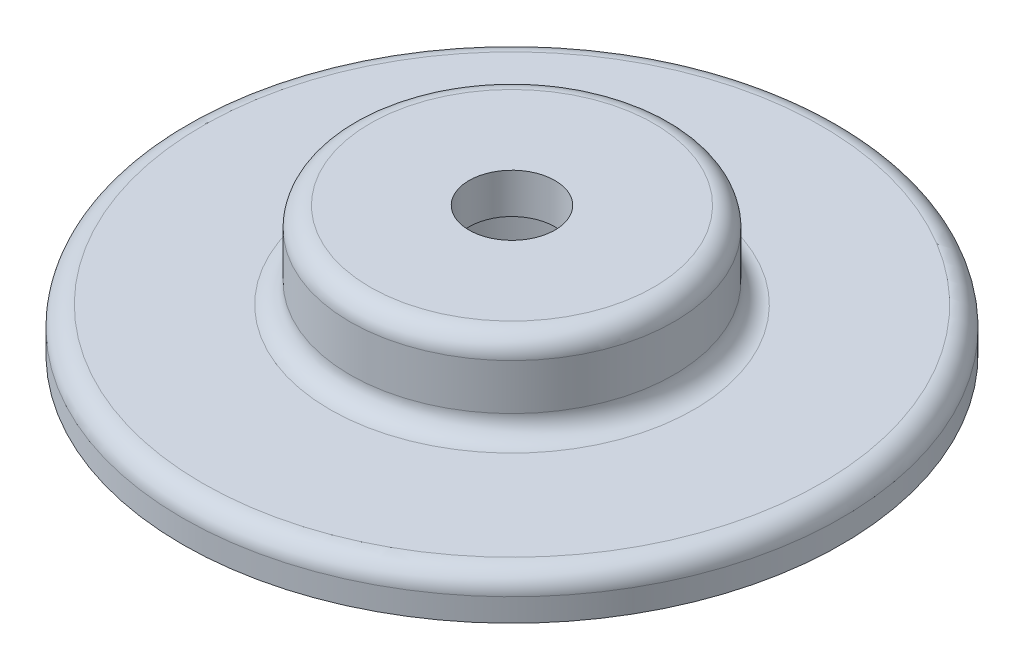
ISO-10303-21;
HEADER;
FILE_DESCRIPTION(('STEP AP214'),'2;1');
FILE_NAME('part.step','',(''),(''),'','','');
FILE_SCHEMA(('AUTOMOTIVE_DESIGN { 1 0 10303 214 1 1 1 1 }'));
ENDSEC;
DATA;
#1=APPLICATION_CONTEXT('core data for automotive mechanical design processes');
#2=APPLICATION_PROTOCOL_DEFINITION('international standard','automotive_design',2000,#1);
#3=PRODUCT_CONTEXT('',#1,'mechanical');
#4=PRODUCT('Part','Part','',(#3));
#5=PRODUCT_RELATED_PRODUCT_CATEGORY('part','',(#4));
#6=PRODUCT_DEFINITION_FORMATION('','',#4);
#7=PRODUCT_DEFINITION_CONTEXT('part definition',#1,'design');
#8=PRODUCT_DEFINITION('design','',#6,#7);
#9=PRODUCT_DEFINITION_SHAPE('','',#8);
#10=(LENGTH_UNIT() NAMED_UNIT(*) SI_UNIT(.MILLI.,.METRE.));
#11=(NAMED_UNIT(*) PLANE_ANGLE_UNIT() SI_UNIT($,.RADIAN.));
#12=(NAMED_UNIT(*) SI_UNIT($,.STERADIAN.) SOLID_ANGLE_UNIT());
#13=UNCERTAINTY_MEASURE_WITH_UNIT(LENGTH_MEASURE(1.E-05),#10,'distance_accuracy_value','');
#14=(GEOMETRIC_REPRESENTATION_CONTEXT(3) GLOBAL_UNCERTAINTY_ASSIGNED_CONTEXT((#13)) GLOBAL_UNIT_ASSIGNED_CONTEXT((#10,
#11,#12)) REPRESENTATION_CONTEXT('',''));
#15=CARTESIAN_POINT('',(0.,0.,0.));
#16=DIRECTION('',(0.,0.,1.));
#17=DIRECTION('',(1.,0.,0.));
#18=AXIS2_PLACEMENT_3D('',#15,#16,#17);
#19=CARTESIAN_POINT('',(0.,4.5,0.));
#20=DIRECTION('',(0.,-1.,0.));
#21=DIRECTION('',(0.,0.,-1.));
#22=AXIS2_PLACEMENT_3D('',#19,#20,#21);
#23=CYLINDRICAL_SURFACE('',#22,11.5);
#24=CARTESIAN_POINT('',(0.,0.799999999999999,0.));
#25=DIRECTION('',(0.,1.,0.));
#26=DIRECTION('',(0.,0.,1.));
#27=AXIS2_PLACEMENT_3D('',#24,#25,#26);
#28=CIRCLE('',#27,11.5);
#29=CARTESIAN_POINT('',(0.,0.799999999999999,11.5));
#30=VERTEX_POINT('',#29);
#31=EDGE_CURVE('E10',#30,#30,#28,.F.);
#32=ORIENTED_EDGE('',*,*,#31,.T.);
#33=EDGE_LOOP('',(#32));
#34=FACE_BOUND('',#33,.T.);
#35=CARTESIAN_POINT('',(0.,0.,0.));
#36=DIRECTION('',(0.,1.,0.));
#37=DIRECTION('',(0.,0.,1.));
#38=AXIS2_PLACEMENT_3D('',#35,#36,#37);
#39=CIRCLE('',#38,11.5);
#40=CARTESIAN_POINT('',(0.,0.,11.5));
#41=VERTEX_POINT('',#40);
#42=EDGE_CURVE('E69',#41,#41,#39,.T.);
#43=ORIENTED_EDGE('',*,*,#42,.T.);
#44=EDGE_LOOP('',(#43));
#45=FACE_BOUND('',#44,.T.);
#46=ADVANCED_FACE('F37',(#34,#45),#23,.T.);
#47=CARTESIAN_POINT('',(0.,4.5,0.));
#48=DIRECTION('',(0.,1.,0.));
#49=DIRECTION('',(0.,0.,1.));
#50=AXIS2_PLACEMENT_3D('',#47,#48,#49);
#51=PLANE('',#50);
#52=CARTESIAN_POINT('',(0.,4.5,0.));
#53=DIRECTION('',(0.,1.,0.));
#54=DIRECTION('',(0.,0.,1.));
#55=AXIS2_PLACEMENT_3D('',#52,#53,#54);
#56=CIRCLE('',#55,4.95);
#57=CARTESIAN_POINT('',(0.,4.5,4.95));
#58=VERTEX_POINT('',#57);
#59=EDGE_CURVE('E65',#58,#58,#56,.T.);
#60=ORIENTED_EDGE('',*,*,#59,.T.);
#61=EDGE_LOOP('',(#60));
#62=FACE_BOUND('',#61,.T.);
#63=CARTESIAN_POINT('',(0.,4.5,0.));
#64=DIRECTION('',(0.,-1.,0.));
#65=DIRECTION('',(0.,0.,-1.));
#66=AXIS2_PLACEMENT_3D('',#63,#64,#65);
#67=CIRCLE('',#66,1.5);
#68=CARTESIAN_POINT('',(0.,4.5,-1.5));
#69=VERTEX_POINT('',#68);
#70=EDGE_CURVE('E78',#69,#69,#67,.T.);
#71=ORIENTED_EDGE('',*,*,#70,.T.);
#72=EDGE_LOOP('',(#71));
#73=FACE_BOUND('',#72,.T.);
#74=ADVANCED_FACE('F90',(#62,#73),#51,.T.);
#75=CARTESIAN_POINT('',(0.,0.,0.));
#76=DIRECTION('',(0.,1.,0.));
#77=DIRECTION('',(0.,0.,1.));
#78=AXIS2_PLACEMENT_3D('',#75,#76,#77);
#79=PLANE('',#78);
#80=CARTESIAN_POINT('',(0.,0.,0.));
#81=DIRECTION('',(0.,-1.,0.));
#82=DIRECTION('',(0.,0.,-1.));
#83=AXIS2_PLACEMENT_3D('',#80,#81,#82);
#84=CIRCLE('',#83,3.65);
#85=CARTESIAN_POINT('',(0.,0.,-3.65));
#86=VERTEX_POINT('',#85);
#87=EDGE_CURVE('E74',#86,#86,#84,.T.);
#88=ORIENTED_EDGE('',*,*,#87,.F.);
#89=EDGE_LOOP('',(#88));
#90=FACE_BOUND('',#89,.T.);
#91=ORIENTED_EDGE('',*,*,#42,.F.);
#92=EDGE_LOOP('',(#91));
#93=FACE_BOUND('',#92,.T.);
#94=ADVANCED_FACE('F108',(#90,#93),#79,.F.);
#95=CARTESIAN_POINT('',(0.,3.1,0.));
#96=DIRECTION('',(0.,-1.,0.));
#97=DIRECTION('',(0.,0.,-1.));
#98=AXIS2_PLACEMENT_3D('',#95,#96,#97);
#99=CYLINDRICAL_SURFACE('',#98,3.65);
#100=CARTESIAN_POINT('',(0.,3.1,0.));
#101=DIRECTION('',(0.,-1.,0.));
#102=DIRECTION('',(0.,0.,-1.));
#103=AXIS2_PLACEMENT_3D('',#100,#101,#102);
#104=CIRCLE('',#103,3.65);
#105=CARTESIAN_POINT('',(0.,3.1,-3.65));
#106=VERTEX_POINT('',#105);
#107=EDGE_CURVE('E73',#106,#106,#104,.T.);
#108=CARTESIAN_POINT('',(0.,3.1,-3.65));
#109=CARTESIAN_POINT('',(0.,3.06770833333333,-3.65));
#110=CARTESIAN_POINT('',(0.,3.03541666666667,-3.65));
#111=CARTESIAN_POINT('',(0.,2.97083333333333,-3.65));
#112=CARTESIAN_POINT('',(0.,2.93854166666667,-3.65));
#113=CARTESIAN_POINT('',(0.,2.87395833333333,-3.65));
#114=CARTESIAN_POINT('',(0.,2.84166666666667,-3.65));
#115=CARTESIAN_POINT('',(0.,2.77708333333333,-3.65));
#116=CARTESIAN_POINT('',(0.,2.74479166666667,-3.65));
#117=CARTESIAN_POINT('',(0.,2.68020833333333,-3.65));
#118=CARTESIAN_POINT('',(0.,2.64791666666667,-3.65));
#119=CARTESIAN_POINT('',(0.,2.58333333333333,-3.65));
#120=CARTESIAN_POINT('',(0.,2.55104166666667,-3.65));
#121=CARTESIAN_POINT('',(0.,2.48645833333333,-3.65));
#122=CARTESIAN_POINT('',(0.,2.45416666666667,-3.65));
#123=CARTESIAN_POINT('',(0.,2.38958333333333,-3.65));
#124=CARTESIAN_POINT('',(0.,2.35729166666667,-3.65));
#125=CARTESIAN_POINT('',(0.,2.29270833333333,-3.65));
#126=CARTESIAN_POINT('',(0.,2.26041666666667,-3.65));
#127=CARTESIAN_POINT('',(0.,2.19583333333333,-3.65));
#128=CARTESIAN_POINT('',(0.,2.16354166666667,-3.65));
#129=CARTESIAN_POINT('',(0.,2.09895833333333,-3.65));
#130=CARTESIAN_POINT('',(0.,2.06666666666667,-3.65));
#131=CARTESIAN_POINT('',(0.,2.00208333333333,-3.65));
#132=CARTESIAN_POINT('',(0.,1.96979166666667,-3.65));
#133=CARTESIAN_POINT('',(0.,1.90520833333333,-3.65));
#134=CARTESIAN_POINT('',(0.,1.87291666666667,-3.65));
#135=CARTESIAN_POINT('',(0.,1.80833333333333,-3.65));
#136=CARTESIAN_POINT('',(0.,1.77604166666667,-3.65));
#137=CARTESIAN_POINT('',(0.,1.71145833333333,-3.65));
#138=CARTESIAN_POINT('',(0.,1.67916666666667,-3.65));
#139=CARTESIAN_POINT('',(0.,1.61458333333333,-3.65));
#140=CARTESIAN_POINT('',(0.,1.58229166666667,-3.65));
#141=CARTESIAN_POINT('',(0.,1.51770833333333,-3.65));
#142=CARTESIAN_POINT('',(0.,1.48541666666667,-3.65));
#143=CARTESIAN_POINT('',(0.,1.42083333333333,-3.65));
#144=CARTESIAN_POINT('',(0.,1.38854166666667,-3.65));
#145=CARTESIAN_POINT('',(0.,1.32395833333333,-3.65));
#146=CARTESIAN_POINT('',(0.,1.29166666666667,-3.65));
#147=CARTESIAN_POINT('',(0.,1.22708333333333,-3.65));
#148=CARTESIAN_POINT('',(0.,1.19479166666667,-3.65));
#149=CARTESIAN_POINT('',(0.,1.13020833333333,-3.65));
#150=CARTESIAN_POINT('',(0.,1.09791666666667,-3.65));
#151=CARTESIAN_POINT('',(0.,1.03333333333333,-3.65));
#152=CARTESIAN_POINT('',(0.,1.00104166666667,-3.65));
#153=CARTESIAN_POINT('',(0.,0.936458333333333,-3.65));
#154=CARTESIAN_POINT('',(0.,0.904166666666667,-3.65));
#155=CARTESIAN_POINT('',(0.,0.839583333333334,-3.65));
#156=CARTESIAN_POINT('',(0.,0.807291666666667,-3.65));
#157=CARTESIAN_POINT('',(0.,0.742708333333333,-3.65));
#158=CARTESIAN_POINT('',(0.,0.710416666666667,-3.65));
#159=CARTESIAN_POINT('',(0.,0.645833333333333,-3.65));
#160=CARTESIAN_POINT('',(0.,0.613541666666667,-3.65));
#161=CARTESIAN_POINT('',(0.,0.548958333333333,-3.65));
#162=CARTESIAN_POINT('',(0.,0.516666666666667,-3.65));
#163=CARTESIAN_POINT('',(0.,0.452083333333333,-3.65));
#164=CARTESIAN_POINT('',(0.,0.419791666666667,-3.65));
#165=CARTESIAN_POINT('',(0.,0.355208333333333,-3.65));
#166=CARTESIAN_POINT('',(0.,0.322916666666667,-3.65));
#167=CARTESIAN_POINT('',(0.,0.258333333333333,-3.65));
#168=CARTESIAN_POINT('',(0.,0.226041666666667,-3.65));
#169=CARTESIAN_POINT('',(0.,0.161458333333333,-3.65));
#170=CARTESIAN_POINT('',(0.,0.129166666666667,-3.65));
#171=CARTESIAN_POINT('',(0.,0.0645833333333335,-3.65));
#172=CARTESIAN_POINT('',(0.,0.0322916666666667,-3.65));
#173=CARTESIAN_POINT('',(0.,0.,-3.65));
#174=B_SPLINE_CURVE_WITH_KNOTS('',3,(#108,#109,#110,#111,#112,#113,#114,#115,#116,#117,#118,
#119,#120,#121,#122,#123,#124,#125,#126,#127,#128,#129,#130,#131,#132,#133,#134,#135,#136,#137,
#138,#139,#140,#141,#142,#143,#144,#145,#146,#147,#148,#149,#150,#151,#152,#153,#154,#155,#156,
#157,#158,#159,#160,#161,#162,#163,#164,#165,#166,#167,#168,#169,#170,#171,#172,#173),
.UNSPECIFIED.,.F.,.F.,(4,2,2,2,2,2,2,2,2,2,2,2,2,2,2,2,2,2,2,2,2,2,2,2,2,2,2,2,2,2,2,2,4),(0.,
0.0968749999999997,0.19375,0.290625,0.3875,0.484375,0.58125,0.678125,0.775,0.871875,0.96875,
1.065625,1.1625,1.259375,1.35625,1.453125,1.55,1.646875,1.74375,1.840625,1.9375,2.034375,
2.13125,2.228125,2.325,2.421875,2.51875,2.615625,2.7125,2.809375,2.90625,3.003125,3.1),.UNSPECIFIED.);
#175=EDGE_CURVE('BSEAM102',#106,#86,#174,.T.);
#176=ORIENTED_EDGE('',*,*,#107,.F.);
#177=ORIENTED_EDGE('',*,*,#87,.T.);
#178=ORIENTED_EDGE('',*,*,#175,.T.);
#179=ORIENTED_EDGE('',*,*,#175,.F.);
#180=EDGE_LOOP('',(#176,#178,#177,#179));
#181=FACE_BOUND('',#180,.T.);
#182=ADVANCED_FACE('F102',(#181),#99,.F.);
#183=CARTESIAN_POINT('',(0.,3.1,0.));
#184=DIRECTION('',(0.,-1.,0.));
#185=DIRECTION('',(0.,0.,-1.));
#186=AXIS2_PLACEMENT_3D('',#183,#184,#185);
#187=PLANE('',#186);
#188=CARTESIAN_POINT('',(0.,3.1,0.));
#189=DIRECTION('',(0.,-1.,0.));
#190=DIRECTION('',(0.,0.,-1.));
#191=AXIS2_PLACEMENT_3D('',#188,#189,#190);
#192=CIRCLE('',#191,1.5);
#193=CARTESIAN_POINT('',(0.,3.1,-1.5));
#194=VERTEX_POINT('',#193);
#195=EDGE_CURVE('E82',#194,#194,#192,.T.);
#196=ORIENTED_EDGE('',*,*,#195,.F.);
#197=EDGE_LOOP('',(#196));
#198=FACE_BOUND('',#197,.T.);
#199=ORIENTED_EDGE('',*,*,#107,.T.);
#200=EDGE_LOOP('',(#199));
#201=FACE_BOUND('',#200,.T.);
#202=ADVANCED_FACE('F96',(#198,#201),#187,.T.);
#203=CARTESIAN_POINT('',(0.,4.5,0.));
#204=DIRECTION('',(0.,-1.,0.));
#205=DIRECTION('',(0.,0.,-1.));
#206=AXIS2_PLACEMENT_3D('',#203,#204,#205);
#207=CYLINDRICAL_SURFACE('',#206,1.5);
#208=ORIENTED_EDGE('',*,*,#70,.F.);
#209=EDGE_LOOP('',(#208));
#210=FACE_BOUND('',#209,.T.);
#211=ORIENTED_EDGE('',*,*,#195,.T.);
#212=EDGE_LOOP('',(#211));
#213=FACE_BOUND('',#212,.T.);
#214=ADVANCED_FACE('F92',(#210,#213),#207,.F.);
#215=CARTESIAN_POINT('',(0.,1.5,0.));
#216=DIRECTION('',(0.,1.,0.));
#217=DIRECTION('',(0.,0.,1.));
#218=AXIS2_PLACEMENT_3D('',#215,#216,#217);
#219=PLANE('',#218);
#220=CARTESIAN_POINT('',(0.,1.5,0.));
#221=DIRECTION('',(0.,1.,0.));
#222=DIRECTION('',(0.,0.,1.));
#223=AXIS2_PLACEMENT_3D('',#220,#221,#222);
#224=CIRCLE('',#223,6.35);
#225=CARTESIAN_POINT('',(0.,1.5,6.35));
#226=VERTEX_POINT('',#225);
#227=EDGE_CURVE('E45',#226,#226,#224,.F.);
#228=ORIENTED_EDGE('',*,*,#227,.T.);
#229=EDGE_LOOP('',(#228));
#230=FACE_BOUND('',#229,.T.);
#231=CARTESIAN_POINT('',(0.,1.5,0.));
#232=DIRECTION('',(0.,1.,0.));
#233=DIRECTION('',(0.,0.,1.));
#234=AXIS2_PLACEMENT_3D('',#231,#232,#233);
#235=CIRCLE('',#234,10.8);
#236=CARTESIAN_POINT('',(0.,1.5,10.8));
#237=VERTEX_POINT('',#236);
#238=EDGE_CURVE('E50',#237,#237,#235,.T.);
#239=ORIENTED_EDGE('',*,*,#238,.T.);
#240=EDGE_LOOP('',(#239));
#241=FACE_BOUND('',#240,.T.);
#242=ADVANCED_FACE('F95',(#230,#241),#219,.T.);
#243=CARTESIAN_POINT('',(0.,1.5,0.));
#244=DIRECTION('',(0.,1.,0.));
#245=DIRECTION('',(0.,0.,1.));
#246=AXIS2_PLACEMENT_3D('',#243,#244,#245);
#247=CYLINDRICAL_SURFACE('',#246,5.65);
#248=CARTESIAN_POINT('',(0.,3.8,0.));
#249=DIRECTION('',(0.,1.,0.));
#250=DIRECTION('',(0.,0.,1.));
#251=AXIS2_PLACEMENT_3D('',#248,#249,#250);
#252=CIRCLE('',#251,5.65);
#253=CARTESIAN_POINT('',(0.,3.8,5.65));
#254=VERTEX_POINT('',#253);
#255=EDGE_CURVE('E55',#254,#254,#252,.F.);
#256=ORIENTED_EDGE('',*,*,#255,.T.);
#257=EDGE_LOOP('',(#256));
#258=FACE_BOUND('',#257,.T.);
#259=CARTESIAN_POINT('',(0.,2.2,0.));
#260=DIRECTION('',(0.,1.,0.));
#261=DIRECTION('',(0.,0.,1.));
#262=AXIS2_PLACEMENT_3D('',#259,#260,#261);
#263=CIRCLE('',#262,5.65);
#264=CARTESIAN_POINT('',(0.,2.2,5.65));
#265=VERTEX_POINT('',#264);
#266=EDGE_CURVE('E61',#265,#265,#263,.T.);
#267=ORIENTED_EDGE('',*,*,#266,.T.);
#268=EDGE_LOOP('',(#267));
#269=FACE_BOUND('',#268,.T.);
#270=ADVANCED_FACE('F128',(#258,#269),#247,.T.);
#271=CARTESIAN_POINT('',(0.,3.8,0.));
#272=DIRECTION('',(0.,1.,0.));
#273=DIRECTION('',(0.,0.,1.));
#274=AXIS2_PLACEMENT_3D('',#271,#272,#273);
#275=TOROIDAL_SURFACE('',#274,4.95,0.7);
#276=ORIENTED_EDGE('',*,*,#255,.F.);
#277=EDGE_LOOP('',(#276));
#278=FACE_BOUND('',#277,.T.);
#279=ORIENTED_EDGE('',*,*,#59,.F.);
#280=EDGE_LOOP('',(#279));
#281=FACE_BOUND('',#280,.T.);
#282=ADVANCED_FACE('F125',(#278,#281),#275,.T.);
#283=CARTESIAN_POINT('',(0.,2.2,0.));
#284=DIRECTION('',(0.,1.,0.));
#285=DIRECTION('',(0.,0.,1.));
#286=AXIS2_PLACEMENT_3D('',#283,#284,#285);
#287=TOROIDAL_SURFACE('',#286,6.35,0.7);
#288=ORIENTED_EDGE('',*,*,#227,.F.);
#289=EDGE_LOOP('',(#288));
#290=FACE_BOUND('',#289,.T.);
#291=ORIENTED_EDGE('',*,*,#266,.F.);
#292=EDGE_LOOP('',(#291));
#293=FACE_BOUND('',#292,.T.);
#294=ADVANCED_FACE('F127',(#290,#293),#287,.F.);
#295=CARTESIAN_POINT('',(0.,0.799999999999999,0.));
#296=DIRECTION('',(0.,1.,0.));
#297=DIRECTION('',(0.,0.,1.));
#298=AXIS2_PLACEMENT_3D('',#295,#296,#297);
#299=TOROIDAL_SURFACE('',#298,10.8,0.7);
#300=ORIENTED_EDGE('',*,*,#31,.F.);
#301=EDGE_LOOP('',(#300));
#302=FACE_BOUND('',#301,.T.);
#303=ORIENTED_EDGE('',*,*,#238,.F.);
#304=EDGE_LOOP('',(#303));
#305=FACE_BOUND('',#304,.T.);
#306=ADVANCED_FACE('F39',(#302,#305),#299,.T.);
#307=CLOSED_SHELL('',(#46,#74,#94,#182,#202,#214,#242,#270,#282,#294,#306));
#308=MANIFOLD_SOLID_BREP('B2',#307);
#309=ADVANCED_BREP_SHAPE_REPRESENTATION('',(#18,#308),#14);
#310=SHAPE_DEFINITION_REPRESENTATION(#9,#309);
ENDSEC;
END-ISO-10303-21;
